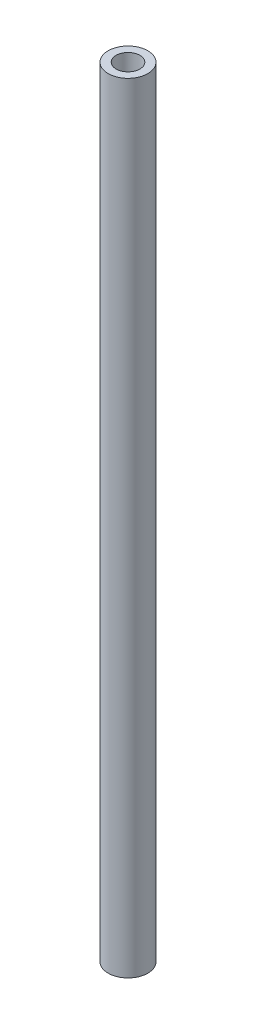
ISO-10303-21;
HEADER;
FILE_DESCRIPTION(('STEP AP214'),'2;1');
FILE_NAME('part.step','',(''),(''),'','','');
FILE_SCHEMA(('AUTOMOTIVE_DESIGN { 1 0 10303 214 1 1 1 1 }'));
ENDSEC;
DATA;
#1=APPLICATION_CONTEXT('core data for automotive mechanical design processes');
#2=APPLICATION_PROTOCOL_DEFINITION('international standard','automotive_design',2000,#1);
#3=PRODUCT_CONTEXT('',#1,'mechanical');
#4=PRODUCT('Part','Part','',(#3));
#5=PRODUCT_RELATED_PRODUCT_CATEGORY('part','',(#4));
#6=PRODUCT_DEFINITION_FORMATION('','',#4);
#7=PRODUCT_DEFINITION_CONTEXT('part definition',#1,'design');
#8=PRODUCT_DEFINITION('design','',#6,#7);
#9=PRODUCT_DEFINITION_SHAPE('','',#8);
#10=(LENGTH_UNIT() NAMED_UNIT(*) SI_UNIT(.MILLI.,.METRE.));
#11=(NAMED_UNIT(*) PLANE_ANGLE_UNIT() SI_UNIT($,.RADIAN.));
#12=(NAMED_UNIT(*) SI_UNIT($,.STERADIAN.) SOLID_ANGLE_UNIT());
#13=UNCERTAINTY_MEASURE_WITH_UNIT(LENGTH_MEASURE(1.E-05),#10,'distance_accuracy_value','');
#14=(GEOMETRIC_REPRESENTATION_CONTEXT(3) GLOBAL_UNCERTAINTY_ASSIGNED_CONTEXT((#13)) GLOBAL_UNIT_ASSIGNED_CONTEXT((#10,
#11,#12)) REPRESENTATION_CONTEXT('',''));
#15=CARTESIAN_POINT('',(0.,0.,0.));
#16=DIRECTION('',(0.,0.,1.));
#17=DIRECTION('',(1.,0.,0.));
#18=AXIS2_PLACEMENT_3D('',#15,#16,#17);
#19=CARTESIAN_POINT('',(0.,98.298,0.));
#20=DIRECTION('',(0.,1.,0.));
#21=DIRECTION('',(0.,0.,1.));
#22=AXIS2_PLACEMENT_3D('',#19,#20,#21);
#23=PLANE('',#22);
#24=CARTESIAN_POINT('',(0.,98.298,0.));
#25=DIRECTION('',(0.,1.,0.));
#26=DIRECTION('',(0.,0.,1.));
#27=AXIS2_PLACEMENT_3D('',#24,#25,#26);
#28=CIRCLE('',#27,2.5);
#29=CARTESIAN_POINT('',(0.,98.298,-2.5));
#30=VERTEX_POINT('',#29);
#31=EDGE_CURVE('E10',#30,#30,#28,.T.);
#32=ORIENTED_EDGE('',*,*,#31,.T.);
#33=EDGE_LOOP('',(#32));
#34=FACE_BOUND('',#33,.T.);
#35=CARTESIAN_POINT('',(0.,98.298,0.));
#36=DIRECTION('',(0.,1.,0.));
#37=DIRECTION('',(0.,0.,1.));
#38=AXIS2_PLACEMENT_3D('',#35,#36,#37);
#39=CIRCLE('',#38,1.5);
#40=CARTESIAN_POINT('',(0.,98.298,-1.5));
#41=VERTEX_POINT('',#40);
#42=EDGE_CURVE('E48',#41,#41,#39,.T.);
#43=ORIENTED_EDGE('',*,*,#42,.F.);
#44=EDGE_LOOP('',(#43));
#45=FACE_BOUND('',#44,.T.);
#46=ADVANCED_FACE('F37',(#34,#45),#23,.T.);
#47=CARTESIAN_POINT('',(0.,0.,0.));
#48=DIRECTION('',(0.,1.,0.));
#49=DIRECTION('',(0.,0.,1.));
#50=AXIS2_PLACEMENT_3D('',#47,#48,#49);
#51=PLANE('',#50);
#52=CARTESIAN_POINT('',(0.,0.,0.));
#53=DIRECTION('',(0.,1.,0.));
#54=DIRECTION('',(0.,0.,1.));
#55=AXIS2_PLACEMENT_3D('',#52,#53,#54);
#56=CIRCLE('',#55,2.5);
#57=CARTESIAN_POINT('',(0.,0.,-2.5));
#58=VERTEX_POINT('',#57);
#59=EDGE_CURVE('E41',#58,#58,#56,.T.);
#60=ORIENTED_EDGE('',*,*,#59,.F.);
#61=EDGE_LOOP('',(#60));
#62=FACE_BOUND('',#61,.T.);
#63=CARTESIAN_POINT('',(0.,0.,0.));
#64=DIRECTION('',(0.,1.,0.));
#65=DIRECTION('',(0.,0.,1.));
#66=AXIS2_PLACEMENT_3D('',#63,#64,#65);
#67=CIRCLE('',#66,1.5);
#68=CARTESIAN_POINT('',(0.,0.,-1.5));
#69=VERTEX_POINT('',#68);
#70=EDGE_CURVE('E50',#69,#69,#67,.T.);
#71=ORIENTED_EDGE('',*,*,#70,.T.);
#72=EDGE_LOOP('',(#71));
#73=FACE_BOUND('',#72,.T.);
#74=ADVANCED_FACE('F60',(#62,#73),#51,.F.);
#75=CARTESIAN_POINT('',(0.,98.298,0.));
#76=DIRECTION('',(0.,-1.,0.));
#77=DIRECTION('',(0.,0.,-1.));
#78=AXIS2_PLACEMENT_3D('',#75,#76,#77);
#79=CYLINDRICAL_SURFACE('',#78,2.5);
#80=CARTESIAN_POINT('',(0.,98.298,-2.5));
#81=CARTESIAN_POINT('',(0.,97.2740625,-2.5));
#82=CARTESIAN_POINT('',(0.,96.250125,-2.5));
#83=CARTESIAN_POINT('',(0.,94.20225,-2.5));
#84=CARTESIAN_POINT('',(0.,93.1783125,-2.5));
#85=CARTESIAN_POINT('',(0.,91.1304375,-2.5));
#86=CARTESIAN_POINT('',(0.,90.1065,-2.5));
#87=CARTESIAN_POINT('',(0.,88.058625,-2.5));
#88=CARTESIAN_POINT('',(0.,87.0346875,-2.5));
#89=CARTESIAN_POINT('',(0.,84.9868125,-2.5));
#90=CARTESIAN_POINT('',(0.,83.962875,-2.5));
#91=CARTESIAN_POINT('',(0.,81.915,-2.5));
#92=CARTESIAN_POINT('',(0.,80.8910625,-2.5));
#93=CARTESIAN_POINT('',(0.,78.8431875,-2.5));
#94=CARTESIAN_POINT('',(0.,77.81925,-2.5));
#95=CARTESIAN_POINT('',(0.,75.771375,-2.5));
#96=CARTESIAN_POINT('',(0.,74.7474375,-2.5));
#97=CARTESIAN_POINT('',(0.,72.6995625,-2.5));
#98=CARTESIAN_POINT('',(0.,71.675625,-2.5));
#99=CARTESIAN_POINT('',(0.,69.62775,-2.5));
#100=CARTESIAN_POINT('',(0.,68.6038125,-2.5));
#101=CARTESIAN_POINT('',(0.,66.5559375,-2.5));
#102=CARTESIAN_POINT('',(0.,65.532,-2.5));
#103=CARTESIAN_POINT('',(0.,63.484125,-2.5));
#104=CARTESIAN_POINT('',(0.,62.4601875,-2.5));
#105=CARTESIAN_POINT('',(0.,60.4123125,-2.5));
#106=CARTESIAN_POINT('',(0.,59.388375,-2.5));
#107=CARTESIAN_POINT('',(0.,57.3405,-2.5));
#108=CARTESIAN_POINT('',(0.,56.3165625,-2.5));
#109=CARTESIAN_POINT('',(0.,54.2686875,-2.5));
#110=CARTESIAN_POINT('',(0.,53.24475,-2.5));
#111=CARTESIAN_POINT('',(0.,51.196875,-2.5));
#112=CARTESIAN_POINT('',(0.,50.1729375,-2.5));
#113=CARTESIAN_POINT('',(0.,48.1250625,-2.5));
#114=CARTESIAN_POINT('',(0.,47.101125,-2.5));
#115=CARTESIAN_POINT('',(0.,45.05325,-2.5));
#116=CARTESIAN_POINT('',(0.,44.0293125,-2.5));
#117=CARTESIAN_POINT('',(0.,41.9814375,-2.5));
#118=CARTESIAN_POINT('',(0.,40.9575,-2.5));
#119=CARTESIAN_POINT('',(0.,38.909625,-2.5));
#120=CARTESIAN_POINT('',(0.,37.8856875,-2.5));
#121=CARTESIAN_POINT('',(0.,35.8378125,-2.5));
#122=CARTESIAN_POINT('',(0.,34.813875,-2.5));
#123=CARTESIAN_POINT('',(0.,32.766,-2.5));
#124=CARTESIAN_POINT('',(0.,31.7420625,-2.5));
#125=CARTESIAN_POINT('',(0.,29.6941875,-2.5));
#126=CARTESIAN_POINT('',(0.,28.67025,-2.5));
#127=CARTESIAN_POINT('',(0.,26.622375,-2.5));
#128=CARTESIAN_POINT('',(0.,25.5984375,-2.5));
#129=CARTESIAN_POINT('',(0.,23.5505625,-2.5));
#130=CARTESIAN_POINT('',(0.,22.526625,-2.5));
#131=CARTESIAN_POINT('',(0.,20.47875,-2.5));
#132=CARTESIAN_POINT('',(0.,19.4548125,-2.5));
#133=CARTESIAN_POINT('',(0.,17.4069375,-2.5));
#134=CARTESIAN_POINT('',(0.,16.383,-2.5));
#135=CARTESIAN_POINT('',(0.,14.335125,-2.5));
#136=CARTESIAN_POINT('',(0.,13.3111875,-2.5));
#137=CARTESIAN_POINT('',(0.,11.2633125,-2.5));
#138=CARTESIAN_POINT('',(0.,10.239375,-2.5));
#139=CARTESIAN_POINT('',(0.,8.19149999999999,-2.5));
#140=CARTESIAN_POINT('',(0.,7.16756249999999,-2.5));
#141=CARTESIAN_POINT('',(0.,5.11968749999999,-2.5));
#142=CARTESIAN_POINT('',(0.,4.09574999999999,-2.5));
#143=CARTESIAN_POINT('',(0.,2.04787499999999,-2.5));
#144=CARTESIAN_POINT('',(0.,1.02393749999999,-2.5));
#145=CARTESIAN_POINT('',(0.,0.,-2.5));
#146=B_SPLINE_CURVE_WITH_KNOTS('',3,(#80,#81,#82,#83,#84,#85,#86,#87,#88,#89,#90,#91,#92,#93,
#94,#95,#96,#97,#98,#99,#100,#101,#102,#103,#104,#105,#106,#107,#108,#109,#110,#111,#112,#113,
#114,#115,#116,#117,#118,#119,#120,#121,#122,#123,#124,#125,#126,#127,#128,#129,#130,#131,#132,
#133,#134,#135,#136,#137,#138,#139,#140,#141,#142,#143,#144,#145),.UNSPECIFIED.,.F.,.F.,(4,2,2,
2,2,2,2,2,2,2,2,2,2,2,2,2,2,2,2,2,2,2,2,2,2,2,2,2,2,2,2,2,4),(0.,3.07181249999999,6.143625,
9.21543749999999,12.28725,15.3590625,18.430875,21.5026875,24.5745,27.6463125,30.718125,
33.7899375,36.86175,39.9335625,43.005375,46.0771875,49.149,52.2208125,55.292625,58.3644375,
61.43625,64.5080625,67.579875,70.6516875,73.7235,76.7953125,79.867125,82.9389375,86.01075,
89.0825625,92.154375,95.2261875,98.298),.UNSPECIFIED.);
#147=EDGE_CURVE('BSEAM39',#30,#58,#146,.T.);
#148=ORIENTED_EDGE('',*,*,#31,.F.);
#149=ORIENTED_EDGE('',*,*,#59,.T.);
#150=ORIENTED_EDGE('',*,*,#147,.T.);
#151=ORIENTED_EDGE('',*,*,#147,.F.);
#152=EDGE_LOOP('',(#148,#150,#149,#151));
#153=FACE_BOUND('',#152,.T.);
#154=ADVANCED_FACE('F39',(#153),#79,.T.);
#155=CARTESIAN_POINT('',(0.,98.298,0.));
#156=DIRECTION('',(0.,-1.,0.));
#157=DIRECTION('',(0.,0.,-1.));
#158=AXIS2_PLACEMENT_3D('',#155,#156,#157);
#159=CYLINDRICAL_SURFACE('',#158,1.5);
#160=CARTESIAN_POINT('',(0.,98.298,-1.5));
#161=CARTESIAN_POINT('',(0.,97.2740625,-1.5));
#162=CARTESIAN_POINT('',(0.,96.250125,-1.5));
#163=CARTESIAN_POINT('',(0.,94.20225,-1.5));
#164=CARTESIAN_POINT('',(0.,93.1783125,-1.5));
#165=CARTESIAN_POINT('',(0.,91.1304375,-1.5));
#166=CARTESIAN_POINT('',(0.,90.1065,-1.5));
#167=CARTESIAN_POINT('',(0.,88.058625,-1.5));
#168=CARTESIAN_POINT('',(0.,87.0346875,-1.5));
#169=CARTESIAN_POINT('',(0.,84.9868125,-1.5));
#170=CARTESIAN_POINT('',(0.,83.962875,-1.5));
#171=CARTESIAN_POINT('',(0.,81.915,-1.5));
#172=CARTESIAN_POINT('',(0.,80.8910625,-1.5));
#173=CARTESIAN_POINT('',(0.,78.8431875,-1.5));
#174=CARTESIAN_POINT('',(0.,77.81925,-1.5));
#175=CARTESIAN_POINT('',(0.,75.771375,-1.5));
#176=CARTESIAN_POINT('',(0.,74.7474375,-1.5));
#177=CARTESIAN_POINT('',(0.,72.6995625,-1.5));
#178=CARTESIAN_POINT('',(0.,71.675625,-1.5));
#179=CARTESIAN_POINT('',(0.,69.62775,-1.5));
#180=CARTESIAN_POINT('',(0.,68.6038125,-1.5));
#181=CARTESIAN_POINT('',(0.,66.5559375,-1.5));
#182=CARTESIAN_POINT('',(0.,65.532,-1.5));
#183=CARTESIAN_POINT('',(0.,63.484125,-1.5));
#184=CARTESIAN_POINT('',(0.,62.4601875,-1.5));
#185=CARTESIAN_POINT('',(0.,60.4123125,-1.5));
#186=CARTESIAN_POINT('',(0.,59.388375,-1.5));
#187=CARTESIAN_POINT('',(0.,57.3405,-1.5));
#188=CARTESIAN_POINT('',(0.,56.3165625,-1.5));
#189=CARTESIAN_POINT('',(0.,54.2686875,-1.5));
#190=CARTESIAN_POINT('',(0.,53.24475,-1.5));
#191=CARTESIAN_POINT('',(0.,51.196875,-1.5));
#192=CARTESIAN_POINT('',(0.,50.1729375,-1.5));
#193=CARTESIAN_POINT('',(0.,48.1250625,-1.5));
#194=CARTESIAN_POINT('',(0.,47.101125,-1.5));
#195=CARTESIAN_POINT('',(0.,45.05325,-1.5));
#196=CARTESIAN_POINT('',(0.,44.0293125,-1.5));
#197=CARTESIAN_POINT('',(0.,41.9814375,-1.5));
#198=CARTESIAN_POINT('',(0.,40.9575,-1.5));
#199=CARTESIAN_POINT('',(0.,38.909625,-1.5));
#200=CARTESIAN_POINT('',(0.,37.8856875,-1.5));
#201=CARTESIAN_POINT('',(0.,35.8378125,-1.5));
#202=CARTESIAN_POINT('',(0.,34.813875,-1.5));
#203=CARTESIAN_POINT('',(0.,32.766,-1.5));
#204=CARTESIAN_POINT('',(0.,31.7420625,-1.5));
#205=CARTESIAN_POINT('',(0.,29.6941875,-1.5));
#206=CARTESIAN_POINT('',(0.,28.67025,-1.5));
#207=CARTESIAN_POINT('',(0.,26.622375,-1.5));
#208=CARTESIAN_POINT('',(0.,25.5984375,-1.5));
#209=CARTESIAN_POINT('',(0.,23.5505625,-1.5));
#210=CARTESIAN_POINT('',(0.,22.526625,-1.5));
#211=CARTESIAN_POINT('',(0.,20.47875,-1.5));
#212=CARTESIAN_POINT('',(0.,19.4548125,-1.5));
#213=CARTESIAN_POINT('',(0.,17.4069375,-1.5));
#214=CARTESIAN_POINT('',(0.,16.383,-1.5));
#215=CARTESIAN_POINT('',(0.,14.335125,-1.5));
#216=CARTESIAN_POINT('',(0.,13.3111875,-1.5));
#217=CARTESIAN_POINT('',(0.,11.2633125,-1.5));
#218=CARTESIAN_POINT('',(0.,10.239375,-1.5));
#219=CARTESIAN_POINT('',(0.,8.19149999999999,-1.5));
#220=CARTESIAN_POINT('',(0.,7.16756249999999,-1.5));
#221=CARTESIAN_POINT('',(0.,5.11968749999999,-1.5));
#222=CARTESIAN_POINT('',(0.,4.09574999999999,-1.5));
#223=CARTESIAN_POINT('',(0.,2.04787499999999,-1.5));
#224=CARTESIAN_POINT('',(0.,1.02393749999999,-1.5));
#225=CARTESIAN_POINT('',(0.,0.,-1.5));
#226=B_SPLINE_CURVE_WITH_KNOTS('',3,(#160,#161,#162,#163,#164,#165,#166,#167,#168,#169,#170,
#171,#172,#173,#174,#175,#176,#177,#178,#179,#180,#181,#182,#183,#184,#185,#186,#187,#188,#189,
#190,#191,#192,#193,#194,#195,#196,#197,#198,#199,#200,#201,#202,#203,#204,#205,#206,#207,#208,
#209,#210,#211,#212,#213,#214,#215,#216,#217,#218,#219,#220,#221,#222,#223,#224,#225),
.UNSPECIFIED.,.F.,.F.,(4,2,2,2,2,2,2,2,2,2,2,2,2,2,2,2,2,2,2,2,2,2,2,2,2,2,2,2,2,2,2,2,4),(0.,
3.07181249999999,6.143625,9.21543749999999,12.28725,15.3590625,18.430875,21.5026875,24.5745,
27.6463125,30.718125,33.7899375,36.86175,39.9335625,43.005375,46.0771875,49.149,52.2208125,
55.292625,58.3644375,61.43625,64.5080625,67.579875,70.6516875,73.7235,76.7953125,79.867125,
82.9389375,86.01075,89.0825625,92.154375,95.2261875,98.298),.UNSPECIFIED.);
#227=EDGE_CURVE('BSEAM56',#41,#69,#226,.T.);
#228=ORIENTED_EDGE('',*,*,#42,.T.);
#229=ORIENTED_EDGE('',*,*,#70,.F.);
#230=ORIENTED_EDGE('',*,*,#227,.T.);
#231=ORIENTED_EDGE('',*,*,#227,.F.);
#232=EDGE_LOOP('',(#228,#230,#229,#231));
#233=FACE_BOUND('',#232,.T.);
#234=ADVANCED_FACE('F56',(#233),#159,.F.);
#235=CLOSED_SHELL('',(#46,#74,#154,#234));
#236=MANIFOLD_SOLID_BREP('B2',#235);
#237=ADVANCED_BREP_SHAPE_REPRESENTATION('',(#18,#236),#14);
#238=SHAPE_DEFINITION_REPRESENTATION(#9,#237);
ENDSEC;
END-ISO-10303-21;
